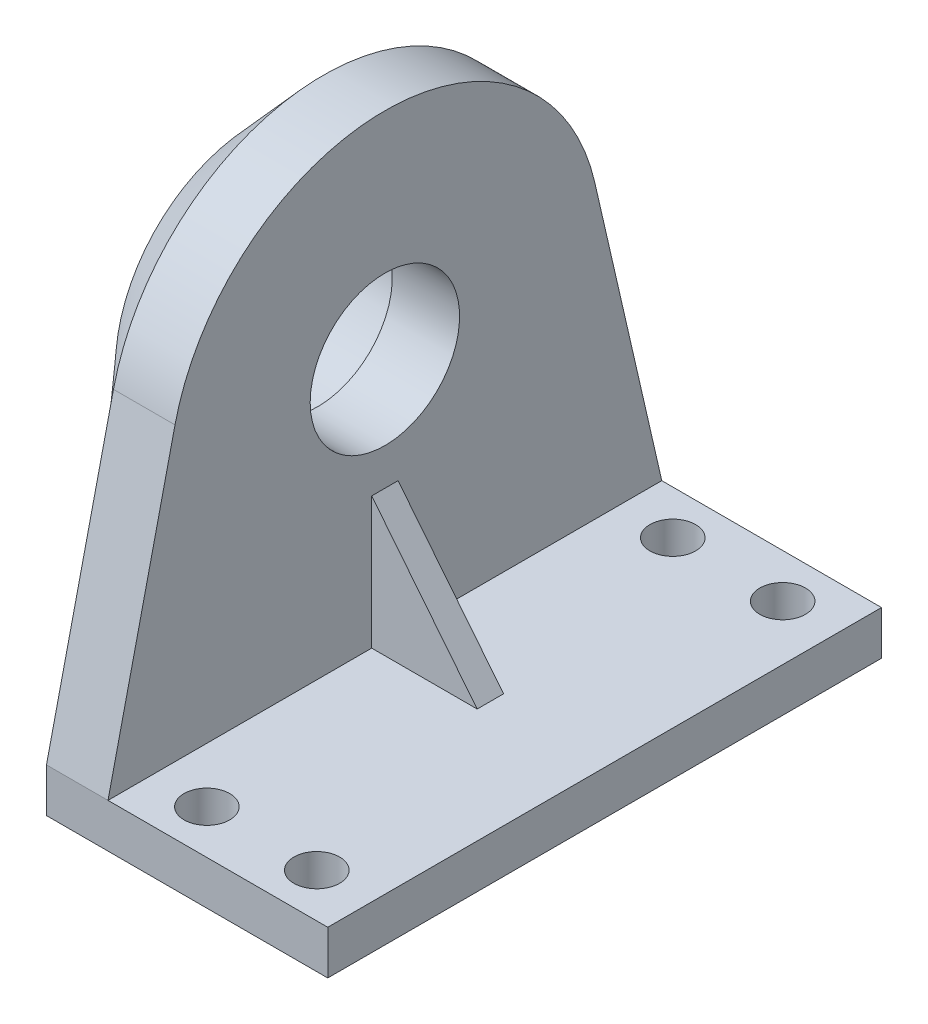
ISO-10303-21;
HEADER;
FILE_DESCRIPTION(('STEP AP214'),'2;1');
FILE_NAME('part.step','',(''),(''),'','','');
FILE_SCHEMA(('AUTOMOTIVE_DESIGN { 1 0 10303 214 1 1 1 1 }'));
ENDSEC;
DATA;
#1=APPLICATION_CONTEXT('core data for automotive mechanical design processes');
#2=APPLICATION_PROTOCOL_DEFINITION('international standard','automotive_design',2000,#1);
#3=PRODUCT_CONTEXT('',#1,'mechanical');
#4=PRODUCT('Part','Part','',(#3));
#5=PRODUCT_RELATED_PRODUCT_CATEGORY('part','',(#4));
#6=PRODUCT_DEFINITION_FORMATION('','',#4);
#7=PRODUCT_DEFINITION_CONTEXT('part definition',#1,'design');
#8=PRODUCT_DEFINITION('design','',#6,#7);
#9=PRODUCT_DEFINITION_SHAPE('','',#8);
#10=(LENGTH_UNIT() NAMED_UNIT(*) SI_UNIT(.MILLI.,.METRE.));
#11=(NAMED_UNIT(*) PLANE_ANGLE_UNIT() SI_UNIT($,.RADIAN.));
#12=(NAMED_UNIT(*) SI_UNIT($,.STERADIAN.) SOLID_ANGLE_UNIT());
#13=UNCERTAINTY_MEASURE_WITH_UNIT(LENGTH_MEASURE(1.E-05),#10,'distance_accuracy_value','');
#14=(GEOMETRIC_REPRESENTATION_CONTEXT(3) GLOBAL_UNCERTAINTY_ASSIGNED_CONTEXT((#13)) GLOBAL_UNIT_ASSIGNED_CONTEXT((#10,
#11,#12)) REPRESENTATION_CONTEXT('',''));
#15=CARTESIAN_POINT('',(0.,0.,0.));
#16=DIRECTION('',(0.,0.,1.));
#17=DIRECTION('',(1.,0.,0.));
#18=AXIS2_PLACEMENT_3D('',#15,#16,#17);
#19=CARTESIAN_POINT('',(14.6534343765316,24.5,0.));
#20=DIRECTION('',(-1.,0.,0.));
#21=DIRECTION('',(0.,0.,1.));
#22=AXIS2_PLACEMENT_3D('',#19,#20,#21);
#23=PLANE('',#22);
#24=CARTESIAN_POINT('',(14.6534343765316,0.,0.));
#25=DIRECTION('',(-1.,0.,0.));
#26=DIRECTION('',(0.,0.,1.));
#27=AXIS2_PLACEMENT_3D('',#24,#25,#26);
#28=CIRCLE('',#27,8.5);
#29=CARTESIAN_POINT('',(14.6534343765316,0.,8.5));
#30=VERTEX_POINT('',#29);
#31=EDGE_CURVE('E229',#30,#30,#28,.T.);
#32=ORIENTED_EDGE('',*,*,#31,.T.);
#33=EDGE_LOOP('',(#32));
#34=FACE_BOUND('',#33,.T.);
#35=DIRECTION('',(0.,-1.,0.));
#36=VECTOR('',#35,1.);
#37=CARTESIAN_POINT('',(14.6534343765316,-27.7,1.5));
#38=LINE('',#37,#36);
#39=CARTESIAN_POINT('',(14.6534343765316,-12.7,1.5));
#40=VERTEX_POINT('',#39);
#41=CARTESIAN_POINT('',(14.6534343765316,-27.7,1.5));
#42=VERTEX_POINT('',#41);
#43=EDGE_CURVE('E122',#40,#42,#38,.T.);
#44=ORIENTED_EDGE('',*,*,#43,.F.);
#45=DIRECTION('',(0.,0.,-1.));
#46=VECTOR('',#45,1.);
#47=CARTESIAN_POINT('',(14.6534343765316,-12.7,1.5));
#48=LINE('',#47,#46);
#49=CARTESIAN_POINT('',(14.6534343765316,-12.7,-1.5));
#50=VERTEX_POINT('',#49);
#51=EDGE_CURVE('E119',#40,#50,#48,.T.);
#52=ORIENTED_EDGE('',*,*,#51,.T.);
#53=DIRECTION('',(0.,-1.,0.));
#54=VECTOR('',#53,1.);
#55=CARTESIAN_POINT('',(14.6534343765316,-27.7,-1.5));
#56=LINE('',#55,#54);
#57=CARTESIAN_POINT('',(14.6534343765316,-27.7,-1.5));
#58=VERTEX_POINT('',#57);
#59=EDGE_CURVE('E129',#50,#58,#56,.T.);
#60=ORIENTED_EDGE('',*,*,#59,.T.);
#61=DIRECTION('',(0.,0.,1.));
#62=VECTOR('',#61,1.);
#63=CARTESIAN_POINT('',(14.6534343765316,-27.7,-31.5));
#64=LINE('',#63,#62);
#65=CARTESIAN_POINT('',(14.6534343765316,-27.7,-31.5));
#66=VERTEX_POINT('',#65);
#67=EDGE_CURVE('E168',#66,#58,#64,.T.);
#68=ORIENTED_EDGE('',*,*,#67,.F.);
#69=DIRECTION('',(0.,0.974623616955568,0.223849961519869));
#70=VECTOR('',#69,1.);
#71=CARTESIAN_POINT('',(14.6534343765316,-27.7,-31.5));
#72=LINE('',#71,#70);
#73=CARTESIAN_POINT('',(14.6534343765316,5.4843240572368,-23.8782786154114));
#74=VERTEX_POINT('',#73);
#75=EDGE_CURVE('E187',#66,#74,#72,.T.);
#76=ORIENTED_EDGE('',*,*,#75,.T.);
#77=CARTESIAN_POINT('',(14.6534343765316,0.,0.));
#78=DIRECTION('',(-1.,0.,0.));
#79=DIRECTION('',(0.,0.,1.));
#80=AXIS2_PLACEMENT_3D('',#77,#78,#79);
#81=CIRCLE('',#80,24.5);
#82=CARTESIAN_POINT('',(14.6534343765316,5.48432405723679,23.8782786154114));
#83=VERTEX_POINT('',#82);
#84=EDGE_CURVE('E226',#83,#74,#81,.T.);
#85=ORIENTED_EDGE('',*,*,#84,.F.);
#86=DIRECTION('',(0.,-0.974623616955568,0.223849961519869));
#87=VECTOR('',#86,1.);
#88=CARTESIAN_POINT('',(14.6534343765316,-27.7,31.5));
#89=LINE('',#88,#87);
#90=CARTESIAN_POINT('',(14.6534343765316,-27.7,31.5));
#91=VERTEX_POINT('',#90);
#92=EDGE_CURVE('E183',#83,#91,#89,.T.);
#93=ORIENTED_EDGE('',*,*,#92,.T.);
#94=EDGE_CURVE('E161',#42,#91,#64,.T.);
#95=ORIENTED_EDGE('',*,*,#94,.F.);
#96=EDGE_LOOP('',(#44,#52,#60,#68,#76,#85,#93,#95));
#97=FACE_BOUND('',#96,.T.);
#98=ADVANCED_FACE('F39',(#34,#97),#23,.F.);
#99=CARTESIAN_POINT('',(39.6534343765316,-27.7,-31.5));
#100=DIRECTION('',(0.,-1.,0.));
#101=DIRECTION('',(0.,0.,-1.));
#102=AXIS2_PLACEMENT_3D('',#99,#100,#101);
#103=PLANE('',#102);
#104=CARTESIAN_POINT('',(20.9034343765316,-27.7,-26.5));
#105=DIRECTION('',(0.,1.,0.));
#106=DIRECTION('',(0.,0.,1.));
#107=AXIS2_PLACEMENT_3D('',#104,#105,#106);
#108=CIRCLE('',#107,2.6);
#109=CARTESIAN_POINT('',(20.9034343765316,-27.7,-23.9));
#110=VERTEX_POINT('',#109);
#111=EDGE_CURVE('E146',#110,#110,#108,.T.);
#112=ORIENTED_EDGE('',*,*,#111,.F.);
#113=EDGE_LOOP('',(#112));
#114=FACE_BOUND('',#113,.T.);
#115=CARTESIAN_POINT('',(33.4034343765315,-27.7,-26.5));
#116=DIRECTION('',(0.,1.,0.));
#117=DIRECTION('',(0.,0.,1.));
#118=AXIS2_PLACEMENT_3D('',#115,#116,#117);
#119=CIRCLE('',#118,2.6);
#120=CARTESIAN_POINT('',(33.4034343765315,-27.7,-23.9));
#121=VERTEX_POINT('',#120);
#122=EDGE_CURVE('E143',#121,#121,#119,.T.);
#123=ORIENTED_EDGE('',*,*,#122,.F.);
#124=EDGE_LOOP('',(#123));
#125=FACE_BOUND('',#124,.T.);
#126=CARTESIAN_POINT('',(33.4034343765315,-27.7,26.5));
#127=DIRECTION('',(0.,1.,0.));
#128=DIRECTION('',(0.,0.,1.));
#129=AXIS2_PLACEMENT_3D('',#126,#127,#128);
#130=CIRCLE('',#129,2.6);
#131=CARTESIAN_POINT('',(33.4034343765315,-27.7,29.1));
#132=VERTEX_POINT('',#131);
#133=EDGE_CURVE('E150',#132,#132,#130,.T.);
#134=ORIENTED_EDGE('',*,*,#133,.F.);
#135=EDGE_LOOP('',(#134));
#136=FACE_BOUND('',#135,.T.);
#137=CARTESIAN_POINT('',(20.9034343765316,-27.7,26.5));
#138=DIRECTION('',(0.,1.,0.));
#139=DIRECTION('',(0.,0.,1.));
#140=AXIS2_PLACEMENT_3D('',#137,#138,#139);
#141=CIRCLE('',#140,2.6);
#142=CARTESIAN_POINT('',(20.9034343765316,-27.7,29.1));
#143=VERTEX_POINT('',#142);
#144=EDGE_CURVE('E138',#143,#143,#141,.T.);
#145=ORIENTED_EDGE('',*,*,#144,.F.);
#146=EDGE_LOOP('',(#145));
#147=FACE_BOUND('',#146,.T.);
#148=DIRECTION('',(1.,0.,0.));
#149=VECTOR('',#148,1.);
#150=CARTESIAN_POINT('',(26.6534343765316,-27.7,1.5));
#151=LINE('',#150,#149);
#152=CARTESIAN_POINT('',(26.6534343765316,-27.7,1.5));
#153=VERTEX_POINT('',#152);
#154=EDGE_CURVE('E123',#42,#153,#151,.T.);
#155=ORIENTED_EDGE('',*,*,#154,.F.);
#156=ORIENTED_EDGE('',*,*,#94,.T.);
#157=DIRECTION('',(-1.,0.,0.));
#158=VECTOR('',#157,1.);
#159=CARTESIAN_POINT('',(39.6534343765316,-27.7,31.5));
#160=LINE('',#159,#158);
#161=CARTESIAN_POINT('',(39.6534343765316,-27.7,31.5));
#162=VERTEX_POINT('',#161);
#163=EDGE_CURVE('E176',#162,#91,#160,.T.);
#164=ORIENTED_EDGE('',*,*,#163,.F.);
#165=DIRECTION('',(0.,0.,1.));
#166=VECTOR('',#165,1.);
#167=CARTESIAN_POINT('',(39.6534343765316,-27.7,-31.5));
#168=LINE('',#167,#166);
#169=CARTESIAN_POINT('',(39.6534343765316,-27.7,-31.5));
#170=VERTEX_POINT('',#169);
#171=EDGE_CURVE('E167',#170,#162,#168,.T.);
#172=ORIENTED_EDGE('',*,*,#171,.F.);
#173=DIRECTION('',(-1.,0.,0.));
#174=VECTOR('',#173,1.);
#175=CARTESIAN_POINT('',(39.6534343765316,-27.7,-31.5));
#176=LINE('',#175,#174);
#177=EDGE_CURVE('E180',#170,#66,#176,.T.);
#178=ORIENTED_EDGE('',*,*,#177,.T.);
#179=ORIENTED_EDGE('',*,*,#67,.T.);
#180=DIRECTION('',(1.,0.,0.));
#181=VECTOR('',#180,1.);
#182=CARTESIAN_POINT('',(26.6534343765316,-27.7,-1.5));
#183=LINE('',#182,#181);
#184=CARTESIAN_POINT('',(26.6534343765316,-27.7,-1.5));
#185=VERTEX_POINT('',#184);
#186=EDGE_CURVE('E134',#58,#185,#183,.T.);
#187=ORIENTED_EDGE('',*,*,#186,.T.);
#188=DIRECTION('',(0.,0.,-1.));
#189=VECTOR('',#188,1.);
#190=CARTESIAN_POINT('',(26.6534343765316,-27.7,1.5));
#191=LINE('',#190,#189);
#192=EDGE_CURVE('E54',#153,#185,#191,.T.);
#193=ORIENTED_EDGE('',*,*,#192,.F.);
#194=EDGE_LOOP('',(#155,#156,#164,#172,#178,#179,#187,#193));
#195=FACE_BOUND('',#194,.T.);
#196=ADVANCED_FACE('F132',(#114,#125,#136,#147,#195),#103,.F.);
#197=CARTESIAN_POINT('',(0.,11.,0.));
#198=DIRECTION('',(1.,0.,0.));
#199=DIRECTION('',(0.,0.,-1.));
#200=AXIS2_PLACEMENT_3D('',#197,#198,#199);
#201=PLANE('',#200);
#202=CARTESIAN_POINT('',(0.,0.,0.));
#203=DIRECTION('',(-1.,0.,0.));
#204=DIRECTION('',(0.,0.,1.));
#205=AXIS2_PLACEMENT_3D('',#202,#203,#204);
#206=CIRCLE('',#205,11.);
#207=CARTESIAN_POINT('',(0.,0.,11.));
#208=VERTEX_POINT('',#207);
#209=EDGE_CURVE('E11',#208,#208,#206,.T.);
#210=ORIENTED_EDGE('',*,*,#209,.F.);
#211=EDGE_LOOP('',(#210));
#212=FACE_BOUND('',#211,.T.);
#213=CARTESIAN_POINT('',(0.,0.,0.));
#214=DIRECTION('',(-1.,0.,0.));
#215=DIRECTION('',(0.,0.,1.));
#216=AXIS2_PLACEMENT_3D('',#213,#214,#215);
#217=CIRCLE('',#216,16.);
#218=CARTESIAN_POINT('',(0.,0.,16.));
#219=VERTEX_POINT('',#218);
#220=EDGE_CURVE('E208',#219,#219,#217,.T.);
#221=ORIENTED_EDGE('',*,*,#220,.T.);
#222=EDGE_LOOP('',(#221));
#223=FACE_BOUND('',#222,.T.);
#224=ADVANCED_FACE('F41',(#212,#223),#201,.F.);
#225=CARTESIAN_POINT('',(0.,0.,0.));
#226=DIRECTION('',(-1.,0.,0.));
#227=DIRECTION('',(0.,0.,1.));
#228=AXIS2_PLACEMENT_3D('',#225,#226,#227);
#229=CYLINDRICAL_SURFACE('',#228,11.);
#230=CARTESIAN_POINT('',(7.,0.,0.));
#231=DIRECTION('',(-1.,0.,0.));
#232=DIRECTION('',(0.,0.,1.));
#233=AXIS2_PLACEMENT_3D('',#230,#231,#232);
#234=CIRCLE('',#233,11.);
#235=CARTESIAN_POINT('',(7.,0.,11.));
#236=VERTEX_POINT('',#235);
#237=EDGE_CURVE('E47',#236,#236,#234,.T.);
#238=ORIENTED_EDGE('',*,*,#237,.F.);
#239=EDGE_LOOP('',(#238));
#240=FACE_BOUND('',#239,.T.);
#241=ORIENTED_EDGE('',*,*,#209,.T.);
#242=EDGE_LOOP('',(#241));
#243=FACE_BOUND('',#242,.T.);
#244=ADVANCED_FACE('F239',(#240,#243),#229,.F.);
#245=CARTESIAN_POINT('',(7.,11.,0.));
#246=DIRECTION('',(1.,0.,0.));
#247=DIRECTION('',(0.,0.,-1.));
#248=AXIS2_PLACEMENT_3D('',#245,#246,#247);
#249=PLANE('',#248);
#250=CARTESIAN_POINT('',(7.,0.,0.));
#251=DIRECTION('',(-1.,0.,0.));
#252=DIRECTION('',(0.,0.,1.));
#253=AXIS2_PLACEMENT_3D('',#250,#251,#252);
#254=CIRCLE('',#253,8.5);
#255=CARTESIAN_POINT('',(7.,0.,8.5));
#256=VERTEX_POINT('',#255);
#257=EDGE_CURVE('E232',#256,#256,#254,.T.);
#258=ORIENTED_EDGE('',*,*,#257,.F.);
#259=EDGE_LOOP('',(#258));
#260=FACE_BOUND('',#259,.T.);
#261=ORIENTED_EDGE('',*,*,#237,.T.);
#262=EDGE_LOOP('',(#261));
#263=FACE_BOUND('',#262,.T.);
#264=ADVANCED_FACE('F237',(#260,#263),#249,.F.);
#265=CARTESIAN_POINT('',(0.,0.,0.));
#266=DIRECTION('',(-1.,0.,0.));
#267=DIRECTION('',(0.,0.,1.));
#268=AXIS2_PLACEMENT_3D('',#265,#266,#267);
#269=CYLINDRICAL_SURFACE('',#268,8.5);
#270=ORIENTED_EDGE('',*,*,#31,.F.);
#271=EDGE_LOOP('',(#270));
#272=FACE_BOUND('',#271,.T.);
#273=ORIENTED_EDGE('',*,*,#257,.T.);
#274=EDGE_LOOP('',(#273));
#275=FACE_BOUND('',#274,.T.);
#276=ADVANCED_FACE('F297',(#272,#275),#269,.F.);
#277=CARTESIAN_POINT('',(0.,0.,0.));
#278=DIRECTION('',(-1.,0.,0.));
#279=DIRECTION('',(0.,0.,1.));
#280=AXIS2_PLACEMENT_3D('',#277,#278,#279);
#281=CYLINDRICAL_SURFACE('',#280,24.5);
#282=ORIENTED_EDGE('',*,*,#84,.T.);
#283=DIRECTION('',(1.,0.,0.));
#284=VECTOR('',#283,1.);
#285=CARTESIAN_POINT('',(7.65343437653155,5.4843240572368,-23.8782786154114));
#286=LINE('',#285,#284);
#287=CARTESIAN_POINT('',(7.65343437653155,5.4843240572368,-23.8782786154114));
#288=VERTEX_POINT('',#287);
#289=EDGE_CURVE('E206',#288,#74,#286,.T.);
#290=ORIENTED_EDGE('',*,*,#289,.F.);
#291=CARTESIAN_POINT('',(7.65343437653155,0.,0.));
#292=DIRECTION('',(-1.,0.,0.));
#293=DIRECTION('',(0.,0.,1.));
#294=AXIS2_PLACEMENT_3D('',#291,#292,#293);
#295=CIRCLE('',#294,24.5);
#296=CARTESIAN_POINT('',(7.65343437653155,5.48432405723679,23.8782786154114));
#297=VERTEX_POINT('',#296);
#298=EDGE_CURVE('E223',#297,#288,#295,.T.);
#299=ORIENTED_EDGE('',*,*,#298,.F.);
#300=DIRECTION('',(1.,0.,0.));
#301=VECTOR('',#300,1.);
#302=CARTESIAN_POINT('',(7.65343437653155,5.48432405723679,23.8782786154114));
#303=LINE('',#302,#301);
#304=EDGE_CURVE('E201',#297,#83,#303,.T.);
#305=ORIENTED_EDGE('',*,*,#304,.T.);
#306=EDGE_LOOP('',(#282,#290,#299,#305));
#307=FACE_BOUND('',#306,.T.);
#308=ADVANCED_FACE('F252',(#307),#281,.T.);
#309=CARTESIAN_POINT('',(7.65343437653155,0.,0.));
#310=DIRECTION('',(1.,0.,0.));
#311=DIRECTION('',(0.,0.,-1.));
#312=AXIS2_PLACEMENT_3D('',#309,#310,#311);
#313=CONICAL_SURFACE('',#312,24.5,0.837758040957284);
#314=ORIENTED_EDGE('',*,*,#220,.F.);
#315=EDGE_LOOP('',(#314));
#316=FACE_BOUND('',#315,.T.);
#317=ORIENTED_EDGE('',*,*,#298,.T.);
#318=CARTESIAN_POINT('',(7.65343437653155,0.,0.));
#319=DIRECTION('',(-1.,0.,0.));
#320=DIRECTION('',(0.,0.,-1.));
#321=AXIS2_PLACEMENT_3D('',#318,#319,#320);
#322=CIRCLE('',#321,24.5);
#323=EDGE_CURVE('E184',#288,#297,#322,.T.);
#324=ORIENTED_EDGE('',*,*,#323,.T.);
#325=EDGE_LOOP('',(#317,#324));
#326=FACE_BOUND('',#325,.T.);
#327=ADVANCED_FACE('F248',(#316,#326),#313,.T.);
#328=CARTESIAN_POINT('',(7.65343437653155,-27.7,-31.5));
#329=DIRECTION('',(0.,0.223849961519869,-0.974623616955568));
#330=DIRECTION('',(0.,0.974623616955568,0.223849961519869));
#331=AXIS2_PLACEMENT_3D('',#328,#329,#330);
#332=PLANE('',#331);
#333=ORIENTED_EDGE('',*,*,#75,.F.);
#334=DIRECTION('',(1.,0.,0.));
#335=VECTOR('',#334,1.);
#336=CARTESIAN_POINT('',(7.65343437653155,-27.7,-31.5));
#337=LINE('',#336,#335);
#338=CARTESIAN_POINT('',(7.65343437653155,-27.7,-31.5));
#339=VERTEX_POINT('',#338);
#340=EDGE_CURVE('E209',#339,#66,#337,.T.);
#341=ORIENTED_EDGE('',*,*,#340,.F.);
#342=DIRECTION('',(0.,0.974623616955568,0.223849961519869));
#343=VECTOR('',#342,1.);
#344=CARTESIAN_POINT('',(7.65343437653155,-27.7,-31.5));
#345=LINE('',#344,#343);
#346=EDGE_CURVE('E198',#339,#288,#345,.T.);
#347=ORIENTED_EDGE('',*,*,#346,.T.);
#348=ORIENTED_EDGE('',*,*,#289,.T.);
#349=EDGE_LOOP('',(#333,#341,#347,#348));
#350=FACE_BOUND('',#349,.T.);
#351=ADVANCED_FACE('F251',(#350),#332,.T.);
#352=CARTESIAN_POINT('',(7.65343437653155,-32.7,-31.5));
#353=DIRECTION('',(0.,0.,-1.));
#354=DIRECTION('',(0.,1.,0.));
#355=AXIS2_PLACEMENT_3D('',#352,#353,#354);
#356=PLANE('',#355);
#357=ORIENTED_EDGE('',*,*,#340,.T.);
#358=ORIENTED_EDGE('',*,*,#177,.F.);
#359=DIRECTION('',(0.,1.,0.));
#360=VECTOR('',#359,1.);
#361=CARTESIAN_POINT('',(39.6534343765316,-32.7,-31.5));
#362=LINE('',#361,#360);
#363=CARTESIAN_POINT('',(39.6534343765316,-32.7,-31.5));
#364=VERTEX_POINT('',#363);
#365=EDGE_CURVE('E164',#364,#170,#362,.T.);
#366=ORIENTED_EDGE('',*,*,#365,.F.);
#367=DIRECTION('',(1.,0.,0.));
#368=VECTOR('',#367,1.);
#369=CARTESIAN_POINT('',(7.65343437653155,-32.7,-31.5));
#370=LINE('',#369,#368);
#371=CARTESIAN_POINT('',(7.65343437653155,-32.7,-31.5));
#372=VERTEX_POINT('',#371);
#373=EDGE_CURVE('E212',#372,#364,#370,.T.);
#374=ORIENTED_EDGE('',*,*,#373,.F.);
#375=DIRECTION('',(0.,1.,0.));
#376=VECTOR('',#375,1.);
#377=CARTESIAN_POINT('',(7.65343437653155,-32.7,-31.5));
#378=LINE('',#377,#376);
#379=EDGE_CURVE('E195',#372,#339,#378,.T.);
#380=ORIENTED_EDGE('',*,*,#379,.T.);
#381=EDGE_LOOP('',(#357,#358,#366,#374,#380));
#382=FACE_BOUND('',#381,.T.);
#383=ADVANCED_FACE('F266',(#382),#356,.T.);
#384=CARTESIAN_POINT('',(7.65343437653155,-32.7,31.5));
#385=DIRECTION('',(0.,-1.,0.));
#386=DIRECTION('',(0.,0.,-1.));
#387=AXIS2_PLACEMENT_3D('',#384,#385,#386);
#388=PLANE('',#387);
#389=CARTESIAN_POINT('',(20.9034343765316,-32.7,26.5));
#390=DIRECTION('',(0.,1.,0.));
#391=DIRECTION('',(0.,0.,1.));
#392=AXIS2_PLACEMENT_3D('',#389,#390,#391);
#393=CIRCLE('',#392,2.6);
#394=CARTESIAN_POINT('',(20.9034343765316,-32.7,29.1));
#395=VERTEX_POINT('',#394);
#396=EDGE_CURVE('E135',#395,#395,#393,.T.);
#397=ORIENTED_EDGE('',*,*,#396,.T.);
#398=EDGE_LOOP('',(#397));
#399=FACE_BOUND('',#398,.T.);
#400=CARTESIAN_POINT('',(33.4034343765315,-32.7,26.5));
#401=DIRECTION('',(0.,1.,0.));
#402=DIRECTION('',(0.,0.,1.));
#403=AXIS2_PLACEMENT_3D('',#400,#401,#402);
#404=CIRCLE('',#403,2.6);
#405=CARTESIAN_POINT('',(33.4034343765315,-32.7,29.1));
#406=VERTEX_POINT('',#405);
#407=EDGE_CURVE('E153',#406,#406,#404,.T.);
#408=ORIENTED_EDGE('',*,*,#407,.T.);
#409=EDGE_LOOP('',(#408));
#410=FACE_BOUND('',#409,.T.);
#411=CARTESIAN_POINT('',(33.4034343765315,-32.7,-26.5));
#412=DIRECTION('',(0.,1.,0.));
#413=DIRECTION('',(0.,0.,1.));
#414=AXIS2_PLACEMENT_3D('',#411,#412,#413);
#415=CIRCLE('',#414,2.6);
#416=CARTESIAN_POINT('',(33.4034343765315,-32.7,-23.9));
#417=VERTEX_POINT('',#416);
#418=EDGE_CURVE('E147',#417,#417,#415,.T.);
#419=ORIENTED_EDGE('',*,*,#418,.T.);
#420=EDGE_LOOP('',(#419));
#421=FACE_BOUND('',#420,.T.);
#422=CARTESIAN_POINT('',(20.9034343765316,-32.7,-26.5));
#423=DIRECTION('',(0.,1.,0.));
#424=DIRECTION('',(0.,0.,1.));
#425=AXIS2_PLACEMENT_3D('',#422,#423,#424);
#426=CIRCLE('',#425,2.6);
#427=CARTESIAN_POINT('',(20.9034343765316,-32.7,-23.9));
#428=VERTEX_POINT('',#427);
#429=EDGE_CURVE('E158',#428,#428,#426,.T.);
#430=ORIENTED_EDGE('',*,*,#429,.T.);
#431=EDGE_LOOP('',(#430));
#432=FACE_BOUND('',#431,.T.);
#433=ORIENTED_EDGE('',*,*,#373,.T.);
#434=DIRECTION('',(0.,0.,-1.));
#435=VECTOR('',#434,1.);
#436=CARTESIAN_POINT('',(39.6534343765316,-32.7,-31.5));
#437=LINE('',#436,#435);
#438=CARTESIAN_POINT('',(39.6534343765316,-32.7,31.5));
#439=VERTEX_POINT('',#438);
#440=EDGE_CURVE('E173',#439,#364,#437,.T.);
#441=ORIENTED_EDGE('',*,*,#440,.F.);
#442=DIRECTION('',(1.,0.,0.));
#443=VECTOR('',#442,1.);
#444=CARTESIAN_POINT('',(7.65343437653155,-32.7,31.5));
#445=LINE('',#444,#443);
#446=CARTESIAN_POINT('',(7.65343437653155,-32.7,31.5));
#447=VERTEX_POINT('',#446);
#448=EDGE_CURVE('E214',#447,#439,#445,.T.);
#449=ORIENTED_EDGE('',*,*,#448,.F.);
#450=DIRECTION('',(0.,0.,-1.));
#451=VECTOR('',#450,1.);
#452=CARTESIAN_POINT('',(7.65343437653155,-32.7,31.5));
#453=LINE('',#452,#451);
#454=EDGE_CURVE('E192',#447,#372,#453,.T.);
#455=ORIENTED_EDGE('',*,*,#454,.T.);
#456=EDGE_LOOP('',(#433,#441,#449,#455));
#457=FACE_BOUND('',#456,.T.);
#458=ADVANCED_FACE('F340',(#399,#410,#421,#432,#457),#388,.T.);
#459=CARTESIAN_POINT('',(7.65343437653155,-32.7,31.5));
#460=DIRECTION('',(0.,0.,1.));
#461=DIRECTION('',(1.,0.,0.));
#462=AXIS2_PLACEMENT_3D('',#459,#460,#461);
#463=PLANE('',#462);
#464=ORIENTED_EDGE('',*,*,#448,.T.);
#465=DIRECTION('',(0.,-1.,0.));
#466=VECTOR('',#465,1.);
#467=CARTESIAN_POINT('',(39.6534343765316,-32.7,31.5));
#468=LINE('',#467,#466);
#469=EDGE_CURVE('E170',#162,#439,#468,.T.);
#470=ORIENTED_EDGE('',*,*,#469,.F.);
#471=ORIENTED_EDGE('',*,*,#163,.T.);
#472=DIRECTION('',(1.,0.,0.));
#473=VECTOR('',#472,1.);
#474=CARTESIAN_POINT('',(7.65343437653155,-27.7,31.5));
#475=LINE('',#474,#473);
#476=CARTESIAN_POINT('',(7.65343437653155,-27.7,31.5));
#477=VERTEX_POINT('',#476);
#478=EDGE_CURVE('E216',#477,#91,#475,.T.);
#479=ORIENTED_EDGE('',*,*,#478,.F.);
#480=DIRECTION('',(0.,-1.,0.));
#481=VECTOR('',#480,1.);
#482=CARTESIAN_POINT('',(7.65343437653155,-32.7,31.5));
#483=LINE('',#482,#481);
#484=EDGE_CURVE('E189',#477,#447,#483,.T.);
#485=ORIENTED_EDGE('',*,*,#484,.T.);
#486=EDGE_LOOP('',(#464,#470,#471,#479,#485));
#487=FACE_BOUND('',#486,.T.);
#488=ADVANCED_FACE('F282',(#487),#463,.T.);
#489=CARTESIAN_POINT('',(7.65343437653155,-27.7,31.5));
#490=DIRECTION('',(0.,0.223849961519869,0.974623616955568));
#491=DIRECTION('',(0.,-0.974623616955568,0.223849961519869));
#492=AXIS2_PLACEMENT_3D('',#489,#490,#491);
#493=PLANE('',#492);
#494=ORIENTED_EDGE('',*,*,#92,.F.);
#495=ORIENTED_EDGE('',*,*,#304,.F.);
#496=DIRECTION('',(0.,-0.974623616955568,0.223849961519869));
#497=VECTOR('',#496,1.);
#498=CARTESIAN_POINT('',(7.65343437653155,-27.7,31.5));
#499=LINE('',#498,#497);
#500=EDGE_CURVE('E62',#297,#477,#499,.T.);
#501=ORIENTED_EDGE('',*,*,#500,.T.);
#502=ORIENTED_EDGE('',*,*,#478,.T.);
#503=EDGE_LOOP('',(#494,#495,#501,#502));
#504=FACE_BOUND('',#503,.T.);
#505=ADVANCED_FACE('F273',(#504),#493,.T.);
#506=CARTESIAN_POINT('',(7.65343437653155,0.,0.));
#507=DIRECTION('',(1.,0.,0.));
#508=DIRECTION('',(0.,0.,-1.));
#509=AXIS2_PLACEMENT_3D('',#506,#507,#508);
#510=PLANE('',#509);
#511=ORIENTED_EDGE('',*,*,#323,.F.);
#512=ORIENTED_EDGE('',*,*,#346,.F.);
#513=ORIENTED_EDGE('',*,*,#379,.F.);
#514=ORIENTED_EDGE('',*,*,#454,.F.);
#515=ORIENTED_EDGE('',*,*,#484,.F.);
#516=ORIENTED_EDGE('',*,*,#500,.F.);
#517=EDGE_LOOP('',(#511,#512,#513,#514,#515,#516));
#518=FACE_BOUND('',#517,.T.);
#519=ADVANCED_FACE('F270',(#518),#510,.F.);
#520=CARTESIAN_POINT('',(39.6534343765316,0.,0.));
#521=DIRECTION('',(1.,0.,0.));
#522=DIRECTION('',(0.,0.,-1.));
#523=AXIS2_PLACEMENT_3D('',#520,#521,#522);
#524=PLANE('',#523);
#525=ORIENTED_EDGE('',*,*,#365,.T.);
#526=ORIENTED_EDGE('',*,*,#171,.T.);
#527=ORIENTED_EDGE('',*,*,#469,.T.);
#528=ORIENTED_EDGE('',*,*,#440,.T.);
#529=EDGE_LOOP('',(#525,#526,#527,#528));
#530=FACE_BOUND('',#529,.T.);
#531=ADVANCED_FACE('F272',(#530),#524,.T.);
#532=CARTESIAN_POINT('',(20.9034343765316,-32.7,-26.5));
#533=DIRECTION('',(0.,1.,0.));
#534=DIRECTION('',(0.,0.,1.));
#535=AXIS2_PLACEMENT_3D('',#532,#533,#534);
#536=CYLINDRICAL_SURFACE('',#535,2.6);
#537=ORIENTED_EDGE('',*,*,#429,.F.);
#538=EDGE_LOOP('',(#537));
#539=FACE_BOUND('',#538,.T.);
#540=ORIENTED_EDGE('',*,*,#111,.T.);
#541=EDGE_LOOP('',(#540));
#542=FACE_BOUND('',#541,.T.);
#543=ADVANCED_FACE('F279',(#539,#542),#536,.F.);
#544=CARTESIAN_POINT('',(33.4034343765315,-32.7,-26.5));
#545=DIRECTION('',(0.,1.,0.));
#546=DIRECTION('',(0.,0.,1.));
#547=AXIS2_PLACEMENT_3D('',#544,#545,#546);
#548=CYLINDRICAL_SURFACE('',#547,2.6);
#549=ORIENTED_EDGE('',*,*,#418,.F.);
#550=EDGE_LOOP('',(#549));
#551=FACE_BOUND('',#550,.T.);
#552=ORIENTED_EDGE('',*,*,#122,.T.);
#553=EDGE_LOOP('',(#552));
#554=FACE_BOUND('',#553,.T.);
#555=ADVANCED_FACE('F407',(#551,#554),#548,.F.);
#556=CARTESIAN_POINT('',(33.4034343765315,-32.7,26.5));
#557=DIRECTION('',(0.,1.,0.));
#558=DIRECTION('',(0.,0.,1.));
#559=AXIS2_PLACEMENT_3D('',#556,#557,#558);
#560=CYLINDRICAL_SURFACE('',#559,2.6);
#561=ORIENTED_EDGE('',*,*,#407,.F.);
#562=EDGE_LOOP('',(#561));
#563=FACE_BOUND('',#562,.T.);
#564=ORIENTED_EDGE('',*,*,#133,.T.);
#565=EDGE_LOOP('',(#564));
#566=FACE_BOUND('',#565,.T.);
#567=ADVANCED_FACE('F418',(#563,#566),#560,.F.);
#568=CARTESIAN_POINT('',(20.9034343765316,-32.7,26.5));
#569=DIRECTION('',(0.,1.,0.));
#570=DIRECTION('',(0.,0.,1.));
#571=AXIS2_PLACEMENT_3D('',#568,#569,#570);
#572=CYLINDRICAL_SURFACE('',#571,2.6);
#573=ORIENTED_EDGE('',*,*,#396,.F.);
#574=EDGE_LOOP('',(#573));
#575=FACE_BOUND('',#574,.T.);
#576=ORIENTED_EDGE('',*,*,#144,.T.);
#577=EDGE_LOOP('',(#576));
#578=FACE_BOUND('',#577,.T.);
#579=ADVANCED_FACE('F429',(#575,#578),#572,.F.);
#580=CARTESIAN_POINT('',(26.6534343765316,-27.7,1.5));
#581=DIRECTION('',(-0.78086880944303,-0.624695047554424,0.));
#582=DIRECTION('',(0.624695047554424,-0.78086880944303,0.));
#583=AXIS2_PLACEMENT_3D('',#580,#581,#582);
#584=PLANE('',#583);
#585=DIRECTION('',(-0.624695047554424,0.78086880944303,0.));
#586=VECTOR('',#585,1.);
#587=CARTESIAN_POINT('',(26.6534343765316,-27.7,-1.5));
#588=LINE('',#587,#586);
#589=EDGE_CURVE('E490',#185,#50,#588,.T.);
#590=ORIENTED_EDGE('',*,*,#589,.T.);
#591=ORIENTED_EDGE('',*,*,#51,.F.);
#592=DIRECTION('',(-0.624695047554424,0.78086880944303,0.));
#593=VECTOR('',#592,1.);
#594=CARTESIAN_POINT('',(26.6534343765316,-27.7,1.5));
#595=LINE('',#594,#593);
#596=EDGE_CURVE('E115',#153,#40,#595,.T.);
#597=ORIENTED_EDGE('',*,*,#596,.F.);
#598=ORIENTED_EDGE('',*,*,#192,.T.);
#599=EDGE_LOOP('',(#590,#591,#597,#598));
#600=FACE_BOUND('',#599,.T.);
#601=ADVANCED_FACE('F117',(#600),#584,.F.);
#602=CARTESIAN_POINT('',(0.,0.,1.5));
#603=DIRECTION('',(0.,0.,-1.));
#604=DIRECTION('',(-1.,0.,0.));
#605=AXIS2_PLACEMENT_3D('',#602,#603,#604);
#606=PLANE('',#605);
#607=ORIENTED_EDGE('',*,*,#154,.T.);
#608=ORIENTED_EDGE('',*,*,#596,.T.);
#609=ORIENTED_EDGE('',*,*,#43,.T.);
#610=EDGE_LOOP('',(#607,#608,#609));
#611=FACE_BOUND('',#610,.T.);
#612=ADVANCED_FACE('F126',(#611),#606,.F.);
#613=CARTESIAN_POINT('',(0.,0.,-1.5));
#614=DIRECTION('',(0.,0.,-1.));
#615=DIRECTION('',(-1.,0.,0.));
#616=AXIS2_PLACEMENT_3D('',#613,#614,#615);
#617=PLANE('',#616);
#618=ORIENTED_EDGE('',*,*,#186,.F.);
#619=ORIENTED_EDGE('',*,*,#59,.F.);
#620=ORIENTED_EDGE('',*,*,#589,.F.);
#621=EDGE_LOOP('',(#618,#619,#620));
#622=FACE_BOUND('',#621,.T.);
#623=ADVANCED_FACE('F473',(#622),#617,.T.);
#624=CLOSED_SHELL('',(#98,#196,#224,#244,#264,#276,#308,#327,#351,#383,#458,#488,#505,#519,#531,
#543,#555,#567,#579,#601,#612,#623));
#625=MANIFOLD_SOLID_BREP('B2',#624);
#626=ADVANCED_BREP_SHAPE_REPRESENTATION('',(#18,#625),#14);
#627=SHAPE_DEFINITION_REPRESENTATION(#9,#626);
ENDSEC;
END-ISO-10303-21;
